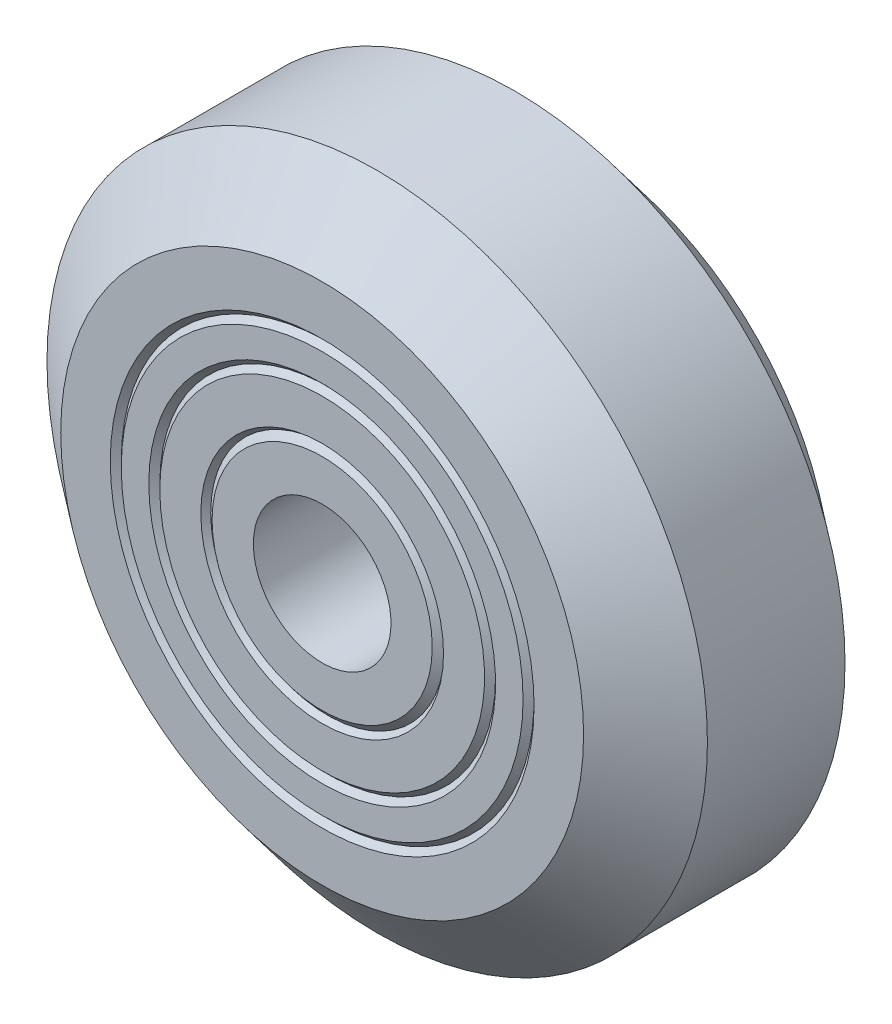
ISO-10303-21;
HEADER;
FILE_DESCRIPTION(('STEP AP214'),'2;1');
FILE_NAME('part.step','',(''),(''),'','','');
FILE_SCHEMA(('AUTOMOTIVE_DESIGN { 1 0 10303 214 1 1 1 1 }'));
ENDSEC;
DATA;
#1=APPLICATION_CONTEXT('core data for automotive mechanical design processes');
#2=APPLICATION_PROTOCOL_DEFINITION('international standard','automotive_design',2000,#1);
#3=PRODUCT_CONTEXT('',#1,'mechanical');
#4=PRODUCT('Part','Part','',(#3));
#5=PRODUCT_RELATED_PRODUCT_CATEGORY('part','',(#4));
#6=PRODUCT_DEFINITION_FORMATION('','',#4);
#7=PRODUCT_DEFINITION_CONTEXT('part definition',#1,'design');
#8=PRODUCT_DEFINITION('design','',#6,#7);
#9=PRODUCT_DEFINITION_SHAPE('','',#8);
#10=(LENGTH_UNIT() NAMED_UNIT(*) SI_UNIT(.MILLI.,.METRE.));
#11=(NAMED_UNIT(*) PLANE_ANGLE_UNIT() SI_UNIT($,.RADIAN.));
#12=(NAMED_UNIT(*) SI_UNIT($,.STERADIAN.) SOLID_ANGLE_UNIT());
#13=UNCERTAINTY_MEASURE_WITH_UNIT(LENGTH_MEASURE(1.E-05),#10,'distance_accuracy_value','');
#14=(GEOMETRIC_REPRESENTATION_CONTEXT(3) GLOBAL_UNCERTAINTY_ASSIGNED_CONTEXT((#13)) GLOBAL_UNIT_ASSIGNED_CONTEXT((#10,
#11,#12)) REPRESENTATION_CONTEXT('',''));
#15=CARTESIAN_POINT('',(0.,0.,0.));
#16=DIRECTION('',(0.,0.,1.));
#17=DIRECTION('',(1.,0.,0.));
#18=AXIS2_PLACEMENT_3D('',#15,#16,#17);
#19=CARTESIAN_POINT('',(0.,7.7,4.5));
#20=DIRECTION('',(0.,0.,1.));
#21=DIRECTION('',(1.,0.,0.));
#22=AXIS2_PLACEMENT_3D('',#19,#20,#21);
#23=PLANE('',#22);
#24=CARTESIAN_POINT('',(0.,0.,4.5));
#25=DIRECTION('',(0.,0.,-1.));
#26=DIRECTION('',(-1.,0.,0.));
#27=AXIS2_PLACEMENT_3D('',#24,#25,#26);
#28=CIRCLE('',#27,7.7);
#29=CARTESIAN_POINT('',(-7.7,0.,4.5));
#30=VERTEX_POINT('',#29);
#31=EDGE_CURVE('E72',#30,#30,#28,.T.);
#32=ORIENTED_EDGE('',*,*,#31,.T.);
#33=EDGE_LOOP('',(#32));
#34=FACE_BOUND('',#33,.T.);
#35=CARTESIAN_POINT('',(0.,0.,4.5));
#36=DIRECTION('',(0.,0.,-1.));
#37=DIRECTION('',(-1.,0.,0.));
#38=AXIS2_PLACEMENT_3D('',#35,#36,#37);
#39=CIRCLE('',#38,9.5);
#40=CARTESIAN_POINT('',(-9.5,0.,4.5));
#41=VERTEX_POINT('',#40);
#42=EDGE_CURVE('E10',#41,#41,#39,.T.);
#43=ORIENTED_EDGE('',*,*,#42,.F.);
#44=EDGE_LOOP('',(#43));
#45=FACE_BOUND('',#44,.T.);
#46=ADVANCED_FACE('F32',(#34,#45),#23,.T.);
#47=CARTESIAN_POINT('',(0.,0.,2.5));
#48=DIRECTION('',(0.,0.,-1.));
#49=DIRECTION('',(-1.,0.,0.));
#50=AXIS2_PLACEMENT_3D('',#47,#48,#49);
#51=CONICAL_SURFACE('',#50,12.,0.896055384571344);
#52=ORIENTED_EDGE('',*,*,#42,.T.);
#53=EDGE_LOOP('',(#52));
#54=FACE_BOUND('',#53,.T.);
#55=CARTESIAN_POINT('',(0.,0.,2.5));
#56=DIRECTION('',(0.,0.,-1.));
#57=DIRECTION('',(-1.,0.,0.));
#58=AXIS2_PLACEMENT_3D('',#55,#56,#57);
#59=CIRCLE('',#58,12.);
#60=CARTESIAN_POINT('',(-12.,0.,2.5));
#61=VERTEX_POINT('',#60);
#62=EDGE_CURVE('E38',#61,#61,#59,.T.);
#63=ORIENTED_EDGE('',*,*,#62,.F.);
#64=EDGE_LOOP('',(#63));
#65=FACE_BOUND('',#64,.T.);
#66=ADVANCED_FACE('F131',(#54,#65),#51,.T.);
#67=CARTESIAN_POINT('',(0.,0.,0.));
#68=DIRECTION('',(0.,0.,-1.));
#69=DIRECTION('',(-1.,0.,0.));
#70=AXIS2_PLACEMENT_3D('',#67,#68,#69);
#71=CYLINDRICAL_SURFACE('',#70,12.);
#72=ORIENTED_EDGE('',*,*,#62,.T.);
#73=EDGE_LOOP('',(#72));
#74=FACE_BOUND('',#73,.T.);
#75=CARTESIAN_POINT('',(0.,0.,-2.5));
#76=DIRECTION('',(0.,0.,-1.));
#77=DIRECTION('',(-1.,0.,0.));
#78=AXIS2_PLACEMENT_3D('',#75,#76,#77);
#79=CIRCLE('',#78,12.);
#80=CARTESIAN_POINT('',(-12.,0.,-2.5));
#81=VERTEX_POINT('',#80);
#82=EDGE_CURVE('E78',#81,#81,#79,.T.);
#83=ORIENTED_EDGE('',*,*,#82,.F.);
#84=EDGE_LOOP('',(#83));
#85=FACE_BOUND('',#84,.T.);
#86=ADVANCED_FACE('F128',(#74,#85),#71,.T.);
#87=CARTESIAN_POINT('',(0.,0.,0.));
#88=DIRECTION('',(0.,0.,-1.));
#89=DIRECTION('',(-1.,0.,0.));
#90=AXIS2_PLACEMENT_3D('',#87,#88,#89);
#91=CYLINDRICAL_SURFACE('',#90,2.5);
#92=CARTESIAN_POINT('',(0.,0.,4.5));
#93=DIRECTION('',(0.,0.,-1.));
#94=DIRECTION('',(-1.,0.,0.));
#95=AXIS2_PLACEMENT_3D('',#92,#93,#94);
#96=CIRCLE('',#95,2.5);
#97=CARTESIAN_POINT('',(-2.5,0.,4.5));
#98=VERTEX_POINT('',#97);
#99=EDGE_CURVE('E42',#98,#98,#96,.T.);
#100=ORIENTED_EDGE('',*,*,#99,.F.);
#101=EDGE_LOOP('',(#100));
#102=FACE_BOUND('',#101,.T.);
#103=CARTESIAN_POINT('',(0.,0.,-4.5));
#104=DIRECTION('',(0.,0.,-1.));
#105=DIRECTION('',(-1.,0.,0.));
#106=AXIS2_PLACEMENT_3D('',#103,#104,#105);
#107=CIRCLE('',#106,2.5);
#108=CARTESIAN_POINT('',(-2.5,0.,-4.5));
#109=VERTEX_POINT('',#108);
#110=EDGE_CURVE('E81',#109,#109,#107,.T.);
#111=ORIENTED_EDGE('',*,*,#110,.T.);
#112=EDGE_LOOP('',(#111));
#113=FACE_BOUND('',#112,.T.);
#114=ADVANCED_FACE('F130',(#102,#113),#91,.F.);
#115=CARTESIAN_POINT('',(0.,2.5,4.5));
#116=DIRECTION('',(0.,0.,1.));
#117=DIRECTION('',(1.,0.,0.));
#118=AXIS2_PLACEMENT_3D('',#115,#116,#117);
#119=PLANE('',#118);
#120=ORIENTED_EDGE('',*,*,#99,.T.);
#121=EDGE_LOOP('',(#120));
#122=FACE_BOUND('',#121,.T.);
#123=CARTESIAN_POINT('',(0.,0.,4.5));
#124=DIRECTION('',(0.,0.,-1.));
#125=DIRECTION('',(-1.,0.,0.));
#126=AXIS2_PLACEMENT_3D('',#123,#124,#125);
#127=CIRCLE('',#126,4.);
#128=CARTESIAN_POINT('',(-4.,0.,4.5));
#129=VERTEX_POINT('',#128);
#130=EDGE_CURVE('E46',#129,#129,#127,.T.);
#131=ORIENTED_EDGE('',*,*,#130,.F.);
#132=EDGE_LOOP('',(#131));
#133=FACE_BOUND('',#132,.T.);
#134=ADVANCED_FACE('F137',(#122,#133),#119,.T.);
#135=CARTESIAN_POINT('',(0.,0.,4.3));
#136=DIRECTION('',(0.,0.,-1.));
#137=DIRECTION('',(-1.,0.,0.));
#138=AXIS2_PLACEMENT_3D('',#135,#136,#137);
#139=CONICAL_SURFACE('',#138,4.25,0.896055384571345);
#140=ORIENTED_EDGE('',*,*,#130,.T.);
#141=EDGE_LOOP('',(#140));
#142=FACE_BOUND('',#141,.T.);
#143=CARTESIAN_POINT('',(0.,0.,4.3));
#144=DIRECTION('',(0.,0.,-1.));
#145=DIRECTION('',(-1.,0.,0.));
#146=AXIS2_PLACEMENT_3D('',#143,#144,#145);
#147=CIRCLE('',#146,4.25);
#148=CARTESIAN_POINT('',(-4.25,0.,4.3));
#149=VERTEX_POINT('',#148);
#150=EDGE_CURVE('E51',#149,#149,#147,.T.);
#151=ORIENTED_EDGE('',*,*,#150,.F.);
#152=EDGE_LOOP('',(#151));
#153=FACE_BOUND('',#152,.T.);
#154=ADVANCED_FACE('F176',(#142,#153),#139,.T.);
#155=CARTESIAN_POINT('',(0.,0.,4.5));
#156=DIRECTION('',(0.,0.,1.));
#157=DIRECTION('',(1.,0.,0.));
#158=AXIS2_PLACEMENT_3D('',#155,#156,#157);
#159=CONICAL_SURFACE('',#158,4.41,0.674740942223552);
#160=ORIENTED_EDGE('',*,*,#150,.T.);
#161=EDGE_LOOP('',(#160));
#162=FACE_BOUND('',#161,.T.);
#163=CARTESIAN_POINT('',(0.,0.,4.5));
#164=DIRECTION('',(0.,0.,-1.));
#165=DIRECTION('',(-1.,0.,0.));
#166=AXIS2_PLACEMENT_3D('',#163,#164,#165);
#167=CIRCLE('',#166,4.41);
#168=CARTESIAN_POINT('',(-4.41,0.,4.5));
#169=VERTEX_POINT('',#168);
#170=EDGE_CURVE('E54',#169,#169,#167,.T.);
#171=ORIENTED_EDGE('',*,*,#170,.F.);
#172=EDGE_LOOP('',(#171));
#173=FACE_BOUND('',#172,.T.);
#174=ADVANCED_FACE('F172',(#162,#173),#159,.F.);
#175=CARTESIAN_POINT('',(0.,4.41,4.5));
#176=DIRECTION('',(0.,0.,1.));
#177=DIRECTION('',(1.,0.,0.));
#178=AXIS2_PLACEMENT_3D('',#175,#176,#177);
#179=PLANE('',#178);
#180=ORIENTED_EDGE('',*,*,#170,.T.);
#181=EDGE_LOOP('',(#180));
#182=FACE_BOUND('',#181,.T.);
#183=CARTESIAN_POINT('',(0.,0.,4.5));
#184=DIRECTION('',(0.,0.,-1.));
#185=DIRECTION('',(-1.,0.,0.));
#186=AXIS2_PLACEMENT_3D('',#183,#184,#185);
#187=CIRCLE('',#186,5.9);
#188=CARTESIAN_POINT('',(-5.9,0.,4.5));
#189=VERTEX_POINT('',#188);
#190=EDGE_CURVE('E57',#189,#189,#187,.T.);
#191=ORIENTED_EDGE('',*,*,#190,.F.);
#192=EDGE_LOOP('',(#191));
#193=FACE_BOUND('',#192,.T.);
#194=ADVANCED_FACE('F168',(#182,#193),#179,.T.);
#195=CARTESIAN_POINT('',(0.,0.,4.3));
#196=DIRECTION('',(0.,0.,-1.));
#197=DIRECTION('',(-1.,0.,0.));
#198=AXIS2_PLACEMENT_3D('',#195,#196,#197);
#199=CONICAL_SURFACE('',#198,6.1,0.785398163397455);
#200=ORIENTED_EDGE('',*,*,#190,.T.);
#201=EDGE_LOOP('',(#200));
#202=FACE_BOUND('',#201,.T.);
#203=CARTESIAN_POINT('',(0.,0.,4.3));
#204=DIRECTION('',(0.,0.,-1.));
#205=DIRECTION('',(-1.,0.,0.));
#206=AXIS2_PLACEMENT_3D('',#203,#204,#205);
#207=CIRCLE('',#206,6.1);
#208=CARTESIAN_POINT('',(-6.1,0.,4.3));
#209=VERTEX_POINT('',#208);
#210=EDGE_CURVE('E60',#209,#209,#207,.T.);
#211=ORIENTED_EDGE('',*,*,#210,.F.);
#212=EDGE_LOOP('',(#211));
#213=FACE_BOUND('',#212,.T.);
#214=ADVANCED_FACE('F164',(#202,#213),#199,.T.);
#215=CARTESIAN_POINT('',(0.,0.,4.5));
#216=DIRECTION('',(0.,0.,1.));
#217=DIRECTION('',(1.,0.,0.));
#218=AXIS2_PLACEMENT_3D('',#215,#216,#217);
#219=CONICAL_SURFACE('',#218,6.3,0.785398163397442);
#220=ORIENTED_EDGE('',*,*,#210,.T.);
#221=EDGE_LOOP('',(#220));
#222=FACE_BOUND('',#221,.T.);
#223=CARTESIAN_POINT('',(0.,0.,4.5));
#224=DIRECTION('',(0.,0.,-1.));
#225=DIRECTION('',(-1.,0.,0.));
#226=AXIS2_PLACEMENT_3D('',#223,#224,#225);
#227=CIRCLE('',#226,6.3);
#228=CARTESIAN_POINT('',(-6.3,0.,4.5));
#229=VERTEX_POINT('',#228);
#230=EDGE_CURVE('E63',#229,#229,#227,.T.);
#231=ORIENTED_EDGE('',*,*,#230,.F.);
#232=EDGE_LOOP('',(#231));
#233=FACE_BOUND('',#232,.T.);
#234=ADVANCED_FACE('F160',(#222,#233),#219,.F.);
#235=CARTESIAN_POINT('',(0.,7.3,4.5));
#236=DIRECTION('',(0.,0.,1.));
#237=DIRECTION('',(1.,0.,0.));
#238=AXIS2_PLACEMENT_3D('',#235,#236,#237);
#239=PLANE('',#238);
#240=ORIENTED_EDGE('',*,*,#230,.T.);
#241=EDGE_LOOP('',(#240));
#242=FACE_BOUND('',#241,.T.);
#243=CARTESIAN_POINT('',(0.,0.,4.5));
#244=DIRECTION('',(0.,0.,-1.));
#245=DIRECTION('',(-1.,0.,0.));
#246=AXIS2_PLACEMENT_3D('',#243,#244,#245);
#247=CIRCLE('',#246,7.3);
#248=CARTESIAN_POINT('',(-7.3,0.,4.5));
#249=VERTEX_POINT('',#248);
#250=EDGE_CURVE('E66',#249,#249,#247,.T.);
#251=ORIENTED_EDGE('',*,*,#250,.F.);
#252=EDGE_LOOP('',(#251));
#253=FACE_BOUND('',#252,.T.);
#254=ADVANCED_FACE('F154',(#242,#253),#239,.T.);
#255=CARTESIAN_POINT('',(0.,0.,4.3));
#256=DIRECTION('',(0.,0.,-1.));
#257=DIRECTION('',(-1.,0.,0.));
#258=AXIS2_PLACEMENT_3D('',#255,#256,#257);
#259=CONICAL_SURFACE('',#258,7.5,0.785398163397455);
#260=ORIENTED_EDGE('',*,*,#250,.T.);
#261=EDGE_LOOP('',(#260));
#262=FACE_BOUND('',#261,.T.);
#263=CARTESIAN_POINT('',(0.,0.,4.3));
#264=DIRECTION('',(0.,0.,-1.));
#265=DIRECTION('',(-1.,0.,0.));
#266=AXIS2_PLACEMENT_3D('',#263,#264,#265);
#267=CIRCLE('',#266,7.5);
#268=CARTESIAN_POINT('',(-7.5,0.,4.3));
#269=VERTEX_POINT('',#268);
#270=EDGE_CURVE('E69',#269,#269,#267,.T.);
#271=ORIENTED_EDGE('',*,*,#270,.F.);
#272=EDGE_LOOP('',(#271));
#273=FACE_BOUND('',#272,.T.);
#274=ADVANCED_FACE('F148',(#262,#273),#259,.T.);
#275=CARTESIAN_POINT('',(0.,0.,4.5));
#276=DIRECTION('',(0.,0.,1.));
#277=DIRECTION('',(1.,0.,0.));
#278=AXIS2_PLACEMENT_3D('',#275,#276,#277);
#279=CONICAL_SURFACE('',#278,7.7,0.78539816339745);
#280=ORIENTED_EDGE('',*,*,#270,.T.);
#281=EDGE_LOOP('',(#280));
#282=FACE_BOUND('',#281,.T.);
#283=ORIENTED_EDGE('',*,*,#31,.F.);
#284=EDGE_LOOP('',(#283));
#285=FACE_BOUND('',#284,.T.);
#286=ADVANCED_FACE('F118',(#282,#285),#279,.F.);
#287=CARTESIAN_POINT('',(0.,7.7,-4.5));
#288=DIRECTION('',(0.,0.,-1.));
#289=DIRECTION('',(1.,0.,0.));
#290=AXIS2_PLACEMENT_3D('',#287,#288,#289);
#291=PLANE('',#290);
#292=CARTESIAN_POINT('',(0.,0.,-4.5));
#293=DIRECTION('',(0.,0.,-1.));
#294=DIRECTION('',(-1.,0.,0.));
#295=AXIS2_PLACEMENT_3D('',#292,#293,#294);
#296=CIRCLE('',#295,7.7);
#297=CARTESIAN_POINT('',(-7.7,0.,-4.5));
#298=VERTEX_POINT('',#297);
#299=EDGE_CURVE('E108',#298,#298,#296,.T.);
#300=ORIENTED_EDGE('',*,*,#299,.F.);
#301=EDGE_LOOP('',(#300));
#302=FACE_BOUND('',#301,.T.);
#303=CARTESIAN_POINT('',(0.,0.,-4.5));
#304=DIRECTION('',(0.,0.,-1.));
#305=DIRECTION('',(-1.,0.,0.));
#306=AXIS2_PLACEMENT_3D('',#303,#304,#305);
#307=CIRCLE('',#306,9.5);
#308=CARTESIAN_POINT('',(-9.5,0.,-4.5));
#309=VERTEX_POINT('',#308);
#310=EDGE_CURVE('E75',#309,#309,#307,.T.);
#311=ORIENTED_EDGE('',*,*,#310,.T.);
#312=EDGE_LOOP('',(#311));
#313=FACE_BOUND('',#312,.T.);
#314=ADVANCED_FACE('F114',(#302,#313),#291,.T.);
#315=CARTESIAN_POINT('',(0.,0.,-2.5));
#316=DIRECTION('',(0.,0.,1.));
#317=DIRECTION('',(-1.,0.,0.));
#318=AXIS2_PLACEMENT_3D('',#315,#316,#317);
#319=CONICAL_SURFACE('',#318,12.,0.896055384571344);
#320=ORIENTED_EDGE('',*,*,#310,.F.);
#321=EDGE_LOOP('',(#320));
#322=FACE_BOUND('',#321,.T.);
#323=ORIENTED_EDGE('',*,*,#82,.T.);
#324=EDGE_LOOP('',(#323));
#325=FACE_BOUND('',#324,.T.);
#326=ADVANCED_FACE('F117',(#322,#325),#319,.T.);
#327=CARTESIAN_POINT('',(0.,2.5,-4.5));
#328=DIRECTION('',(0.,0.,-1.));
#329=DIRECTION('',(1.,0.,0.));
#330=AXIS2_PLACEMENT_3D('',#327,#328,#329);
#331=PLANE('',#330);
#332=ORIENTED_EDGE('',*,*,#110,.F.);
#333=EDGE_LOOP('',(#332));
#334=FACE_BOUND('',#333,.T.);
#335=CARTESIAN_POINT('',(0.,0.,-4.5));
#336=DIRECTION('',(0.,0.,-1.));
#337=DIRECTION('',(-1.,0.,0.));
#338=AXIS2_PLACEMENT_3D('',#335,#336,#337);
#339=CIRCLE('',#338,4.);
#340=CARTESIAN_POINT('',(-4.,0.,-4.5));
#341=VERTEX_POINT('',#340);
#342=EDGE_CURVE('E84',#341,#341,#339,.T.);
#343=ORIENTED_EDGE('',*,*,#342,.T.);
#344=EDGE_LOOP('',(#343));
#345=FACE_BOUND('',#344,.T.);
#346=ADVANCED_FACE('F124',(#334,#345),#331,.T.);
#347=CARTESIAN_POINT('',(0.,0.,-4.3));
#348=DIRECTION('',(0.,0.,1.));
#349=DIRECTION('',(-1.,0.,0.));
#350=AXIS2_PLACEMENT_3D('',#347,#348,#349);
#351=CONICAL_SURFACE('',#350,4.25,0.896055384571345);
#352=ORIENTED_EDGE('',*,*,#342,.F.);
#353=EDGE_LOOP('',(#352));
#354=FACE_BOUND('',#353,.T.);
#355=CARTESIAN_POINT('',(0.,0.,-4.3));
#356=DIRECTION('',(0.,0.,-1.));
#357=DIRECTION('',(-1.,0.,0.));
#358=AXIS2_PLACEMENT_3D('',#355,#356,#357);
#359=CIRCLE('',#358,4.25);
#360=CARTESIAN_POINT('',(-4.25,0.,-4.3));
#361=VERTEX_POINT('',#360);
#362=EDGE_CURVE('E87',#361,#361,#359,.T.);
#363=ORIENTED_EDGE('',*,*,#362,.T.);
#364=EDGE_LOOP('',(#363));
#365=FACE_BOUND('',#364,.T.);
#366=ADVANCED_FACE('F207',(#354,#365),#351,.T.);
#367=CARTESIAN_POINT('',(0.,0.,-4.5));
#368=DIRECTION('',(0.,0.,-1.));
#369=DIRECTION('',(1.,0.,0.));
#370=AXIS2_PLACEMENT_3D('',#367,#368,#369);
#371=CONICAL_SURFACE('',#370,4.41,0.674740942223552);
#372=ORIENTED_EDGE('',*,*,#362,.F.);
#373=EDGE_LOOP('',(#372));
#374=FACE_BOUND('',#373,.T.);
#375=CARTESIAN_POINT('',(0.,0.,-4.5));
#376=DIRECTION('',(0.,0.,-1.));
#377=DIRECTION('',(-1.,0.,0.));
#378=AXIS2_PLACEMENT_3D('',#375,#376,#377);
#379=CIRCLE('',#378,4.41);
#380=CARTESIAN_POINT('',(-4.41,0.,-4.5));
#381=VERTEX_POINT('',#380);
#382=EDGE_CURVE('E90',#381,#381,#379,.T.);
#383=ORIENTED_EDGE('',*,*,#382,.T.);
#384=EDGE_LOOP('',(#383));
#385=FACE_BOUND('',#384,.T.);
#386=ADVANCED_FACE('F213',(#374,#385),#371,.F.);
#387=CARTESIAN_POINT('',(0.,4.41,-4.5));
#388=DIRECTION('',(0.,0.,-1.));
#389=DIRECTION('',(1.,0.,0.));
#390=AXIS2_PLACEMENT_3D('',#387,#388,#389);
#391=PLANE('',#390);
#392=ORIENTED_EDGE('',*,*,#382,.F.);
#393=EDGE_LOOP('',(#392));
#394=FACE_BOUND('',#393,.T.);
#395=CARTESIAN_POINT('',(0.,0.,-4.5));
#396=DIRECTION('',(0.,0.,-1.));
#397=DIRECTION('',(-1.,0.,0.));
#398=AXIS2_PLACEMENT_3D('',#395,#396,#397);
#399=CIRCLE('',#398,5.9);
#400=CARTESIAN_POINT('',(-5.9,0.,-4.5));
#401=VERTEX_POINT('',#400);
#402=EDGE_CURVE('E93',#401,#401,#399,.T.);
#403=ORIENTED_EDGE('',*,*,#402,.T.);
#404=EDGE_LOOP('',(#403));
#405=FACE_BOUND('',#404,.T.);
#406=ADVANCED_FACE('F219',(#394,#405),#391,.T.);
#407=CARTESIAN_POINT('',(0.,0.,-4.3));
#408=DIRECTION('',(0.,0.,1.));
#409=DIRECTION('',(-1.,0.,0.));
#410=AXIS2_PLACEMENT_3D('',#407,#408,#409);
#411=CONICAL_SURFACE('',#410,6.1,0.785398163397455);
#412=ORIENTED_EDGE('',*,*,#402,.F.);
#413=EDGE_LOOP('',(#412));
#414=FACE_BOUND('',#413,.T.);
#415=CARTESIAN_POINT('',(0.,0.,-4.3));
#416=DIRECTION('',(0.,0.,-1.));
#417=DIRECTION('',(-1.,0.,0.));
#418=AXIS2_PLACEMENT_3D('',#415,#416,#417);
#419=CIRCLE('',#418,6.1);
#420=CARTESIAN_POINT('',(-6.1,0.,-4.3));
#421=VERTEX_POINT('',#420);
#422=EDGE_CURVE('E96',#421,#421,#419,.T.);
#423=ORIENTED_EDGE('',*,*,#422,.T.);
#424=EDGE_LOOP('',(#423));
#425=FACE_BOUND('',#424,.T.);
#426=ADVANCED_FACE('F225',(#414,#425),#411,.T.);
#427=CARTESIAN_POINT('',(0.,0.,-4.5));
#428=DIRECTION('',(0.,0.,-1.));
#429=DIRECTION('',(1.,0.,0.));
#430=AXIS2_PLACEMENT_3D('',#427,#428,#429);
#431=CONICAL_SURFACE('',#430,6.3,0.785398163397442);
#432=ORIENTED_EDGE('',*,*,#422,.F.);
#433=EDGE_LOOP('',(#432));
#434=FACE_BOUND('',#433,.T.);
#435=CARTESIAN_POINT('',(0.,0.,-4.5));
#436=DIRECTION('',(0.,0.,-1.));
#437=DIRECTION('',(-1.,0.,0.));
#438=AXIS2_PLACEMENT_3D('',#435,#436,#437);
#439=CIRCLE('',#438,6.3);
#440=CARTESIAN_POINT('',(-6.3,0.,-4.5));
#441=VERTEX_POINT('',#440);
#442=EDGE_CURVE('E99',#441,#441,#439,.T.);
#443=ORIENTED_EDGE('',*,*,#442,.T.);
#444=EDGE_LOOP('',(#443));
#445=FACE_BOUND('',#444,.T.);
#446=ADVANCED_FACE('F231',(#434,#445),#431,.F.);
#447=CARTESIAN_POINT('',(0.,7.3,-4.5));
#448=DIRECTION('',(0.,0.,-1.));
#449=DIRECTION('',(1.,0.,0.));
#450=AXIS2_PLACEMENT_3D('',#447,#448,#449);
#451=PLANE('',#450);
#452=ORIENTED_EDGE('',*,*,#442,.F.);
#453=EDGE_LOOP('',(#452));
#454=FACE_BOUND('',#453,.T.);
#455=CARTESIAN_POINT('',(0.,0.,-4.5));
#456=DIRECTION('',(0.,0.,-1.));
#457=DIRECTION('',(-1.,0.,0.));
#458=AXIS2_PLACEMENT_3D('',#455,#456,#457);
#459=CIRCLE('',#458,7.3);
#460=CARTESIAN_POINT('',(-7.3,0.,-4.5));
#461=VERTEX_POINT('',#460);
#462=EDGE_CURVE('E102',#461,#461,#459,.T.);
#463=ORIENTED_EDGE('',*,*,#462,.T.);
#464=EDGE_LOOP('',(#463));
#465=FACE_BOUND('',#464,.T.);
#466=ADVANCED_FACE('F237',(#454,#465),#451,.T.);
#467=CARTESIAN_POINT('',(0.,0.,-4.3));
#468=DIRECTION('',(0.,0.,1.));
#469=DIRECTION('',(-1.,0.,0.));
#470=AXIS2_PLACEMENT_3D('',#467,#468,#469);
#471=CONICAL_SURFACE('',#470,7.5,0.785398163397455);
#472=ORIENTED_EDGE('',*,*,#462,.F.);
#473=EDGE_LOOP('',(#472));
#474=FACE_BOUND('',#473,.T.);
#475=CARTESIAN_POINT('',(0.,0.,-4.3));
#476=DIRECTION('',(0.,0.,-1.));
#477=DIRECTION('',(-1.,0.,0.));
#478=AXIS2_PLACEMENT_3D('',#475,#476,#477);
#479=CIRCLE('',#478,7.5);
#480=CARTESIAN_POINT('',(-7.5,0.,-4.3));
#481=VERTEX_POINT('',#480);
#482=EDGE_CURVE('E105',#481,#481,#479,.T.);
#483=ORIENTED_EDGE('',*,*,#482,.T.);
#484=EDGE_LOOP('',(#483));
#485=FACE_BOUND('',#484,.T.);
#486=ADVANCED_FACE('F243',(#474,#485),#471,.T.);
#487=CARTESIAN_POINT('',(0.,0.,-4.5));
#488=DIRECTION('',(0.,0.,-1.));
#489=DIRECTION('',(1.,0.,0.));
#490=AXIS2_PLACEMENT_3D('',#487,#488,#489);
#491=CONICAL_SURFACE('',#490,7.7,0.78539816339745);
#492=ORIENTED_EDGE('',*,*,#482,.F.);
#493=EDGE_LOOP('',(#492));
#494=FACE_BOUND('',#493,.T.);
#495=ORIENTED_EDGE('',*,*,#299,.T.);
#496=EDGE_LOOP('',(#495));
#497=FACE_BOUND('',#496,.T.);
#498=ADVANCED_FACE('F112',(#494,#497),#491,.F.);
#499=CLOSED_SHELL('',(#46,#66,#86,#114,#134,#154,#174,#194,#214,#234,#254,#274,#286,#314,#326,
#346,#366,#386,#406,#426,#446,#466,#486,#498));
#500=MANIFOLD_SOLID_BREP('B2',#499);
#501=ADVANCED_BREP_SHAPE_REPRESENTATION('',(#18,#500),#14);
#502=SHAPE_DEFINITION_REPRESENTATION(#9,#501);
ENDSEC;
END-ISO-10303-21;
